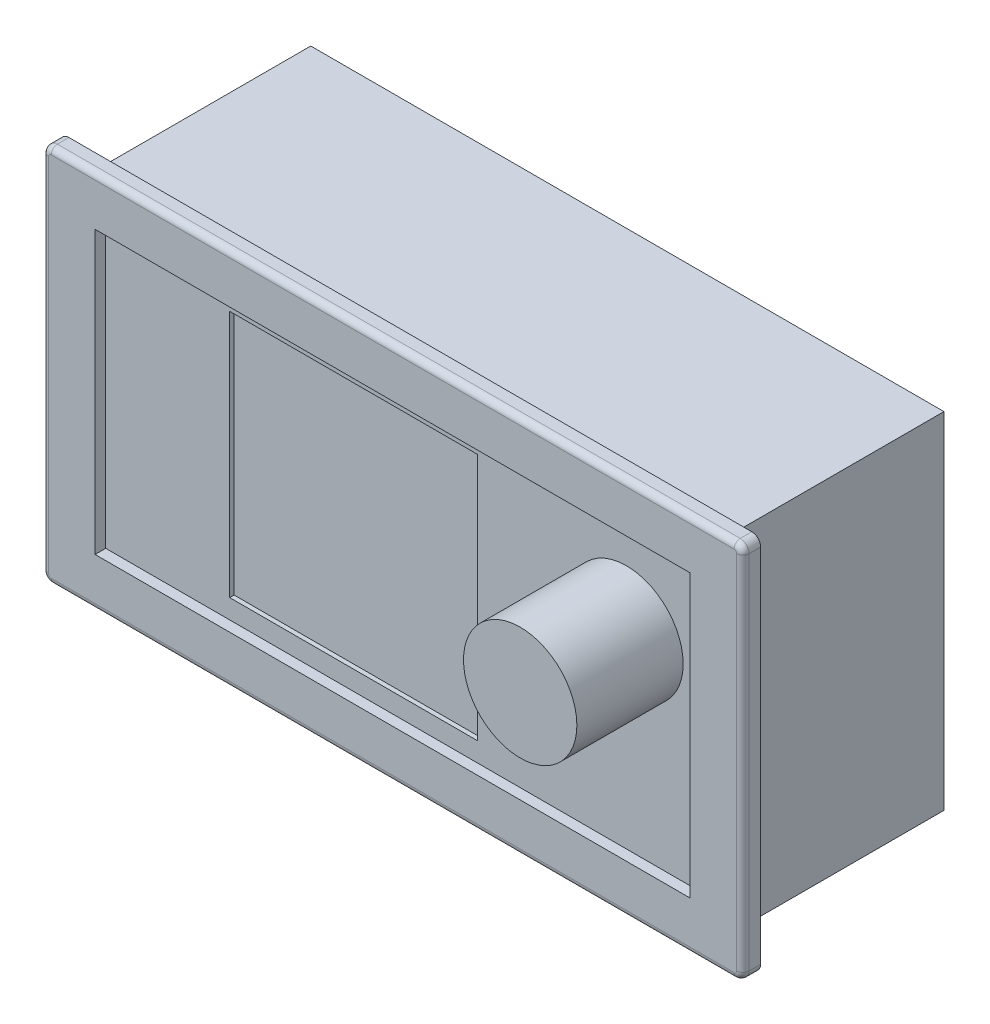
ISO-10303-21;
HEADER;
FILE_DESCRIPTION(('STEP AP214'),'2;1');
FILE_NAME('part.step','',(''),(''),'','','');
FILE_SCHEMA(('AUTOMOTIVE_DESIGN { 1 0 10303 214 1 1 1 1 }'));
ENDSEC;
DATA;
#1=APPLICATION_CONTEXT('core data for automotive mechanical design processes');
#2=APPLICATION_PROTOCOL_DEFINITION('international standard','automotive_design',2000,#1);
#3=PRODUCT_CONTEXT('',#1,'mechanical');
#4=PRODUCT('Part','Part','',(#3));
#5=PRODUCT_RELATED_PRODUCT_CATEGORY('part','',(#4));
#6=PRODUCT_DEFINITION_FORMATION('','',#4);
#7=PRODUCT_DEFINITION_CONTEXT('part definition',#1,'design');
#8=PRODUCT_DEFINITION('design','',#6,#7);
#9=PRODUCT_DEFINITION_SHAPE('','',#8);
#10=(LENGTH_UNIT() NAMED_UNIT(*) SI_UNIT(.MILLI.,.METRE.));
#11=(NAMED_UNIT(*) PLANE_ANGLE_UNIT() SI_UNIT($,.RADIAN.));
#12=(NAMED_UNIT(*) SI_UNIT($,.STERADIAN.) SOLID_ANGLE_UNIT());
#13=UNCERTAINTY_MEASURE_WITH_UNIT(LENGTH_MEASURE(1.E-05),#10,'distance_accuracy_value','');
#14=(GEOMETRIC_REPRESENTATION_CONTEXT(3) GLOBAL_UNCERTAINTY_ASSIGNED_CONTEXT((#13)) GLOBAL_UNIT_ASSIGNED_CONTEXT((#10,
#11,#12)) REPRESENTATION_CONTEXT('',''));
#15=CARTESIAN_POINT('',(0.,0.,0.));
#16=DIRECTION('',(0.,0.,1.));
#17=DIRECTION('',(1.,0.,0.));
#18=AXIS2_PLACEMENT_3D('',#15,#16,#17);
#19=CARTESIAN_POINT('',(0.,0.,26.5));
#20=DIRECTION('',(0.,0.,1.));
#21=DIRECTION('',(1.,0.,0.));
#22=AXIS2_PLACEMENT_3D('',#19,#20,#21);
#23=PLANE('',#22);
#24=DIRECTION('',(0.,1.,0.));
#25=VECTOR('',#24,1.);
#26=CARTESIAN_POINT('',(33.6,15.9,26.5));
#27=LINE('',#26,#25);
#28=CARTESIAN_POINT('',(33.6,-15.9,26.5));
#29=VERTEX_POINT('',#28);
#30=CARTESIAN_POINT('',(33.6,15.9,26.5));
#31=VERTEX_POINT('',#30);
#32=EDGE_CURVE('E64',#29,#31,#27,.T.);
#33=ORIENTED_EDGE('',*,*,#32,.F.);
#34=DIRECTION('',(1.,0.,0.));
#35=VECTOR('',#34,1.);
#36=CARTESIAN_POINT('',(-33.6,-15.9,26.5));
#37=LINE('',#36,#35);
#38=CARTESIAN_POINT('',(-33.6,-15.9,26.5));
#39=VERTEX_POINT('',#38);
#40=EDGE_CURVE('E251',#39,#29,#37,.T.);
#41=ORIENTED_EDGE('',*,*,#40,.F.);
#42=DIRECTION('',(0.,-1.,0.));
#43=VECTOR('',#42,1.);
#44=CARTESIAN_POINT('',(-33.6,15.9,26.5));
#45=LINE('',#44,#43);
#46=CARTESIAN_POINT('',(-33.6,15.9,26.5));
#47=VERTEX_POINT('',#46);
#48=EDGE_CURVE('E265',#47,#39,#45,.T.);
#49=ORIENTED_EDGE('',*,*,#48,.F.);
#50=DIRECTION('',(-1.,0.,0.));
#51=VECTOR('',#50,1.);
#52=CARTESIAN_POINT('',(-33.6,15.9,26.5));
#53=LINE('',#52,#51);
#54=EDGE_CURVE('E262',#31,#47,#53,.T.);
#55=ORIENTED_EDGE('',*,*,#54,.F.);
#56=EDGE_LOOP('',(#33,#41,#49,#55));
#57=FACE_BOUND('',#56,.T.);
#58=CARTESIAN_POINT('',(-38.55,20.4,26.5));
#59=DIRECTION('',(0.,0.,1.));
#60=DIRECTION('',(1.,0.,0.));
#61=AXIS2_PLACEMENT_3D('',#58,#59,#60);
#62=CIRCLE('',#61,0.3);
#63=CARTESIAN_POINT('',(-38.85,20.4,26.5));
#64=VERTEX_POINT('',#63);
#65=CARTESIAN_POINT('',(-38.55,20.7,26.5));
#66=VERTEX_POINT('',#65);
#67=EDGE_CURVE('E360',#64,#66,#62,.F.);
#68=ORIENTED_EDGE('',*,*,#67,.F.);
#69=DIRECTION('',(0.,-1.,0.));
#70=VECTOR('',#69,1.);
#71=CARTESIAN_POINT('',(-38.85,-21.4,26.5));
#72=LINE('',#71,#70);
#73=CARTESIAN_POINT('',(-38.85,-20.4,26.5));
#74=VERTEX_POINT('',#73);
#75=EDGE_CURVE('E329',#64,#74,#72,.T.);
#76=ORIENTED_EDGE('',*,*,#75,.T.);
#77=CARTESIAN_POINT('',(-38.55,-20.4,26.5));
#78=DIRECTION('',(0.,0.,1.));
#79=DIRECTION('',(1.,0.,0.));
#80=AXIS2_PLACEMENT_3D('',#77,#78,#79);
#81=CIRCLE('',#80,0.3);
#82=CARTESIAN_POINT('',(-38.55,-20.7,26.5));
#83=VERTEX_POINT('',#82);
#84=EDGE_CURVE('E352',#83,#74,#81,.F.);
#85=ORIENTED_EDGE('',*,*,#84,.F.);
#86=DIRECTION('',(1.,0.,0.));
#87=VECTOR('',#86,1.);
#88=CARTESIAN_POINT('',(39.55,-20.7,26.5));
#89=LINE('',#88,#87);
#90=CARTESIAN_POINT('',(38.55,-20.7,26.5));
#91=VERTEX_POINT('',#90);
#92=EDGE_CURVE('E332',#83,#91,#89,.T.);
#93=ORIENTED_EDGE('',*,*,#92,.T.);
#94=CARTESIAN_POINT('',(38.55,-20.4,26.5));
#95=DIRECTION('',(0.,0.,1.));
#96=DIRECTION('',(1.,0.,0.));
#97=AXIS2_PLACEMENT_3D('',#94,#95,#96);
#98=CIRCLE('',#97,0.3);
#99=CARTESIAN_POINT('',(38.85,-20.4,26.5));
#100=VERTEX_POINT('',#99);
#101=EDGE_CURVE('E354',#100,#91,#98,.F.);
#102=ORIENTED_EDGE('',*,*,#101,.F.);
#103=DIRECTION('',(0.,1.,0.));
#104=VECTOR('',#103,1.);
#105=CARTESIAN_POINT('',(38.85,21.4,26.5));
#106=LINE('',#105,#104);
#107=CARTESIAN_POINT('',(38.85,20.4,26.5));
#108=VERTEX_POINT('',#107);
#109=EDGE_CURVE('E323',#100,#108,#106,.T.);
#110=ORIENTED_EDGE('',*,*,#109,.T.);
#111=CARTESIAN_POINT('',(38.55,20.4,26.5));
#112=DIRECTION('',(0.,0.,1.));
#113=DIRECTION('',(1.,0.,0.));
#114=AXIS2_PLACEMENT_3D('',#111,#112,#113);
#115=CIRCLE('',#114,0.3);
#116=CARTESIAN_POINT('',(38.55,20.7,26.5));
#117=VERTEX_POINT('',#116);
#118=EDGE_CURVE('E357',#117,#108,#115,.F.);
#119=ORIENTED_EDGE('',*,*,#118,.F.);
#120=DIRECTION('',(-1.,0.,0.));
#121=VECTOR('',#120,1.);
#122=CARTESIAN_POINT('',(-39.55,20.7,26.5));
#123=LINE('',#122,#121);
#124=EDGE_CURVE('E326',#117,#66,#123,.T.);
#125=ORIENTED_EDGE('',*,*,#124,.T.);
#126=EDGE_LOOP('',(#68,#76,#85,#93,#102,#110,#119,#125));
#127=FACE_BOUND('',#126,.T.);
#128=ADVANCED_FACE('F39',(#57,#127),#23,.T.);
#129=CARTESIAN_POINT('',(35.75,19.5,24.5));
#130=DIRECTION('',(-1.,0.,0.));
#131=DIRECTION('',(0.,-1.,0.));
#132=AXIS2_PLACEMENT_3D('',#129,#130,#131);
#133=PLANE('',#132);
#134=DIRECTION('',(0.,1.,0.));
#135=VECTOR('',#134,1.);
#136=CARTESIAN_POINT('',(35.75,19.5,0.));
#137=LINE('',#136,#135);
#138=CARTESIAN_POINT('',(35.75,-19.5,0.));
#139=VERTEX_POINT('',#138);
#140=CARTESIAN_POINT('',(35.75,19.5,0.));
#141=VERTEX_POINT('',#140);
#142=EDGE_CURVE('E290',#139,#141,#137,.T.);
#143=ORIENTED_EDGE('',*,*,#142,.T.);
#144=DIRECTION('',(0.,0.,-1.));
#145=VECTOR('',#144,1.);
#146=CARTESIAN_POINT('',(35.75,19.5,24.5));
#147=LINE('',#146,#145);
#148=CARTESIAN_POINT('',(35.75,19.5,24.5));
#149=VERTEX_POINT('',#148);
#150=EDGE_CURVE('E320',#149,#141,#147,.T.);
#151=ORIENTED_EDGE('',*,*,#150,.F.);
#152=DIRECTION('',(0.,1.,0.));
#153=VECTOR('',#152,1.);
#154=CARTESIAN_POINT('',(35.75,19.5,24.5));
#155=LINE('',#154,#153);
#156=CARTESIAN_POINT('',(35.75,-19.5,24.5));
#157=VERTEX_POINT('',#156);
#158=EDGE_CURVE('E291',#157,#149,#155,.T.);
#159=ORIENTED_EDGE('',*,*,#158,.F.);
#160=DIRECTION('',(0.,0.,-1.));
#161=VECTOR('',#160,1.);
#162=CARTESIAN_POINT('',(35.75,-19.5,24.5));
#163=LINE('',#162,#161);
#164=EDGE_CURVE('E304',#157,#139,#163,.T.);
#165=ORIENTED_EDGE('',*,*,#164,.T.);
#166=EDGE_LOOP('',(#143,#151,#159,#165));
#167=FACE_BOUND('',#166,.T.);
#168=ADVANCED_FACE('F483',(#167),#133,.F.);
#169=CARTESIAN_POINT('',(-35.75,19.5,24.5));
#170=DIRECTION('',(0.,-1.,0.));
#171=DIRECTION('',(0.,0.,-1.));
#172=AXIS2_PLACEMENT_3D('',#169,#170,#171);
#173=PLANE('',#172);
#174=DIRECTION('',(-1.,0.,0.));
#175=VECTOR('',#174,1.);
#176=CARTESIAN_POINT('',(-35.75,19.5,0.));
#177=LINE('',#176,#175);
#178=CARTESIAN_POINT('',(-35.75,19.5,0.));
#179=VERTEX_POINT('',#178);
#180=EDGE_CURVE('E307',#141,#179,#177,.T.);
#181=ORIENTED_EDGE('',*,*,#180,.T.);
#182=DIRECTION('',(0.,0.,-1.));
#183=VECTOR('',#182,1.);
#184=CARTESIAN_POINT('',(-35.75,19.5,24.5));
#185=LINE('',#184,#183);
#186=CARTESIAN_POINT('',(-35.75,19.5,24.5));
#187=VERTEX_POINT('',#186);
#188=EDGE_CURVE('E317',#187,#179,#185,.T.);
#189=ORIENTED_EDGE('',*,*,#188,.F.);
#190=DIRECTION('',(-1.,0.,0.));
#191=VECTOR('',#190,1.);
#192=CARTESIAN_POINT('',(-35.75,19.5,24.5));
#193=LINE('',#192,#191);
#194=EDGE_CURVE('E294',#149,#187,#193,.T.);
#195=ORIENTED_EDGE('',*,*,#194,.F.);
#196=ORIENTED_EDGE('',*,*,#150,.T.);
#197=EDGE_LOOP('',(#181,#189,#195,#196));
#198=FACE_BOUND('',#197,.T.);
#199=ADVANCED_FACE('F489',(#198),#173,.F.);
#200=CARTESIAN_POINT('',(-35.75,19.5,24.5));
#201=DIRECTION('',(1.,0.,0.));
#202=DIRECTION('',(0.,0.,-1.));
#203=AXIS2_PLACEMENT_3D('',#200,#201,#202);
#204=PLANE('',#203);
#205=DIRECTION('',(0.,-1.,0.));
#206=VECTOR('',#205,1.);
#207=CARTESIAN_POINT('',(-35.75,19.5,0.));
#208=LINE('',#207,#206);
#209=CARTESIAN_POINT('',(-35.75,-19.5,0.));
#210=VERTEX_POINT('',#209);
#211=EDGE_CURVE('E309',#179,#210,#208,.T.);
#212=ORIENTED_EDGE('',*,*,#211,.T.);
#213=DIRECTION('',(0.,0.,-1.));
#214=VECTOR('',#213,1.);
#215=CARTESIAN_POINT('',(-35.75,-19.5,24.5));
#216=LINE('',#215,#214);
#217=CARTESIAN_POINT('',(-35.75,-19.5,24.5));
#218=VERTEX_POINT('',#217);
#219=EDGE_CURVE('E314',#218,#210,#216,.T.);
#220=ORIENTED_EDGE('',*,*,#219,.F.);
#221=DIRECTION('',(0.,-1.,0.));
#222=VECTOR('',#221,1.);
#223=CARTESIAN_POINT('',(-35.75,19.5,24.5));
#224=LINE('',#223,#222);
#225=EDGE_CURVE('E298',#187,#218,#224,.T.);
#226=ORIENTED_EDGE('',*,*,#225,.F.);
#227=ORIENTED_EDGE('',*,*,#188,.T.);
#228=EDGE_LOOP('',(#212,#220,#226,#227));
#229=FACE_BOUND('',#228,.T.);
#230=ADVANCED_FACE('F610',(#229),#204,.F.);
#231=CARTESIAN_POINT('',(-35.75,-19.5,24.5));
#232=DIRECTION('',(0.,1.,0.));
#233=DIRECTION('',(0.,0.,1.));
#234=AXIS2_PLACEMENT_3D('',#231,#232,#233);
#235=PLANE('',#234);
#236=DIRECTION('',(1.,0.,0.));
#237=VECTOR('',#236,1.);
#238=CARTESIAN_POINT('',(-35.75,-19.5,0.));
#239=LINE('',#238,#237);
#240=EDGE_CURVE('E295',#210,#139,#239,.T.);
#241=ORIENTED_EDGE('',*,*,#240,.T.);
#242=ORIENTED_EDGE('',*,*,#164,.F.);
#243=DIRECTION('',(1.,0.,0.));
#244=VECTOR('',#243,1.);
#245=CARTESIAN_POINT('',(-35.75,-19.5,24.5));
#246=LINE('',#245,#244);
#247=EDGE_CURVE('E301',#218,#157,#246,.T.);
#248=ORIENTED_EDGE('',*,*,#247,.F.);
#249=ORIENTED_EDGE('',*,*,#219,.T.);
#250=EDGE_LOOP('',(#241,#242,#248,#249));
#251=FACE_BOUND('',#250,.T.);
#252=ADVANCED_FACE('F605',(#251),#235,.F.);
#253=CARTESIAN_POINT('',(0.,0.,0.));
#254=DIRECTION('',(0.,0.,1.));
#255=DIRECTION('',(1.,0.,0.));
#256=AXIS2_PLACEMENT_3D('',#253,#254,#255);
#257=PLANE('',#256);
#258=ORIENTED_EDGE('',*,*,#142,.F.);
#259=ORIENTED_EDGE('',*,*,#240,.F.);
#260=ORIENTED_EDGE('',*,*,#211,.F.);
#261=ORIENTED_EDGE('',*,*,#180,.F.);
#262=EDGE_LOOP('',(#258,#259,#260,#261));
#263=FACE_BOUND('',#262,.T.);
#264=ADVANCED_FACE('F498',(#263),#257,.F.);
#265=CARTESIAN_POINT('',(0.,0.,24.5));
#266=DIRECTION('',(0.,0.,1.));
#267=DIRECTION('',(1.,0.,0.));
#268=AXIS2_PLACEMENT_3D('',#265,#266,#267);
#269=PLANE('',#268);
#270=DIRECTION('',(1.,0.,0.));
#271=VECTOR('',#270,1.);
#272=CARTESIAN_POINT('',(-39.55,-21.4,24.5));
#273=LINE('',#272,#271);
#274=CARTESIAN_POINT('',(-38.55,-21.4,24.5));
#275=VERTEX_POINT('',#274);
#276=CARTESIAN_POINT('',(38.55,-21.4,24.5));
#277=VERTEX_POINT('',#276);
#278=EDGE_CURVE('E287',#275,#277,#273,.T.);
#279=ORIENTED_EDGE('',*,*,#278,.F.);
#280=CARTESIAN_POINT('',(-38.55,-20.4,24.5));
#281=DIRECTION('',(0.,0.,1.));
#282=DIRECTION('',(1.,0.,0.));
#283=AXIS2_PLACEMENT_3D('',#280,#281,#282);
#284=CIRCLE('',#283,1.);
#285=CARTESIAN_POINT('',(-39.55,-20.4,24.5));
#286=VERTEX_POINT('',#285);
#287=EDGE_CURVE('E385',#275,#286,#284,.F.);
#288=ORIENTED_EDGE('',*,*,#287,.T.);
#289=DIRECTION('',(0.,-1.,0.));
#290=VECTOR('',#289,1.);
#291=CARTESIAN_POINT('',(-39.55,21.4,24.5));
#292=LINE('',#291,#290);
#293=CARTESIAN_POINT('',(-39.55,20.4,24.5));
#294=VERTEX_POINT('',#293);
#295=EDGE_CURVE('E284',#294,#286,#292,.T.);
#296=ORIENTED_EDGE('',*,*,#295,.F.);
#297=CARTESIAN_POINT('',(-38.55,20.4,24.5));
#298=DIRECTION('',(0.,0.,1.));
#299=DIRECTION('',(1.,0.,0.));
#300=AXIS2_PLACEMENT_3D('',#297,#298,#299);
#301=CIRCLE('',#300,1.);
#302=CARTESIAN_POINT('',(-38.55,21.4,24.5));
#303=VERTEX_POINT('',#302);
#304=EDGE_CURVE('E379',#294,#303,#301,.F.);
#305=ORIENTED_EDGE('',*,*,#304,.T.);
#306=DIRECTION('',(-1.,0.,0.));
#307=VECTOR('',#306,1.);
#308=CARTESIAN_POINT('',(-39.55,21.4,24.5));
#309=LINE('',#308,#307);
#310=CARTESIAN_POINT('',(38.55,21.4,24.5));
#311=VERTEX_POINT('',#310);
#312=EDGE_CURVE('E280',#311,#303,#309,.T.);
#313=ORIENTED_EDGE('',*,*,#312,.F.);
#314=CARTESIAN_POINT('',(38.55,20.4,24.5));
#315=DIRECTION('',(0.,0.,1.));
#316=DIRECTION('',(1.,0.,0.));
#317=AXIS2_PLACEMENT_3D('',#314,#315,#316);
#318=CIRCLE('',#317,1.);
#319=CARTESIAN_POINT('',(39.55,20.4,24.5));
#320=VERTEX_POINT('',#319);
#321=EDGE_CURVE('E381',#311,#320,#318,.F.);
#322=ORIENTED_EDGE('',*,*,#321,.T.);
#323=DIRECTION('',(0.,1.,0.));
#324=VECTOR('',#323,1.);
#325=CARTESIAN_POINT('',(39.55,21.4,24.5));
#326=LINE('',#325,#324);
#327=CARTESIAN_POINT('',(39.55,-20.4,24.5));
#328=VERTEX_POINT('',#327);
#329=EDGE_CURVE('E277',#328,#320,#326,.T.);
#330=ORIENTED_EDGE('',*,*,#329,.F.);
#331=CARTESIAN_POINT('',(38.55,-20.4,24.5));
#332=DIRECTION('',(0.,0.,1.));
#333=DIRECTION('',(1.,0.,0.));
#334=AXIS2_PLACEMENT_3D('',#331,#332,#333);
#335=CIRCLE('',#334,1.);
#336=EDGE_CURVE('E383',#328,#277,#335,.F.);
#337=ORIENTED_EDGE('',*,*,#336,.T.);
#338=EDGE_LOOP('',(#279,#288,#296,#305,#313,#322,#330,#337));
#339=FACE_BOUND('',#338,.T.);
#340=ORIENTED_EDGE('',*,*,#247,.T.);
#341=ORIENTED_EDGE('',*,*,#158,.T.);
#342=ORIENTED_EDGE('',*,*,#194,.T.);
#343=ORIENTED_EDGE('',*,*,#225,.T.);
#344=EDGE_LOOP('',(#340,#341,#342,#343));
#345=FACE_BOUND('',#344,.T.);
#346=ADVANCED_FACE('F421',(#339,#345),#269,.F.);
#347=CARTESIAN_POINT('',(39.55,21.4,26.5));
#348=DIRECTION('',(-1.,0.,0.));
#349=DIRECTION('',(0.,-1.,0.));
#350=AXIS2_PLACEMENT_3D('',#347,#348,#349);
#351=PLANE('',#350);
#352=DIRECTION('',(0.,1.,0.));
#353=VECTOR('',#352,1.);
#354=CARTESIAN_POINT('',(39.55,-21.4,25.8));
#355=LINE('',#354,#353);
#356=CARTESIAN_POINT('',(39.55,20.4,25.8));
#357=VERTEX_POINT('',#356);
#358=CARTESIAN_POINT('',(39.55,-20.4,25.8));
#359=VERTEX_POINT('',#358);
#360=EDGE_CURVE('E344',#357,#359,#355,.F.);
#361=ORIENTED_EDGE('',*,*,#360,.T.);
#362=DIRECTION('',(0.,0.,-1.));
#363=VECTOR('',#362,1.);
#364=CARTESIAN_POINT('',(39.55,-20.4,26.5));
#365=LINE('',#364,#363);
#366=EDGE_CURVE('E393',#359,#328,#365,.T.);
#367=ORIENTED_EDGE('',*,*,#366,.T.);
#368=ORIENTED_EDGE('',*,*,#329,.T.);
#369=DIRECTION('',(0.,0.,-1.));
#370=VECTOR('',#369,1.);
#371=CARTESIAN_POINT('',(39.55,20.4,26.5));
#372=LINE('',#371,#370);
#373=EDGE_CURVE('E391',#320,#357,#372,.F.);
#374=ORIENTED_EDGE('',*,*,#373,.T.);
#375=EDGE_LOOP('',(#361,#367,#368,#374));
#376=FACE_BOUND('',#375,.T.);
#377=ADVANCED_FACE('F441',(#376),#351,.F.);
#378=CARTESIAN_POINT('',(-39.55,21.4,26.5));
#379=DIRECTION('',(0.,-1.,0.));
#380=DIRECTION('',(0.,0.,-1.));
#381=AXIS2_PLACEMENT_3D('',#378,#379,#380);
#382=PLANE('',#381);
#383=DIRECTION('',(-1.,0.,0.));
#384=VECTOR('',#383,1.);
#385=CARTESIAN_POINT('',(39.55,21.4,25.8));
#386=LINE('',#385,#384);
#387=CARTESIAN_POINT('',(-38.55,21.4,25.8));
#388=VERTEX_POINT('',#387);
#389=CARTESIAN_POINT('',(38.55,21.4,25.8));
#390=VERTEX_POINT('',#389);
#391=EDGE_CURVE('E341',#388,#390,#386,.F.);
#392=ORIENTED_EDGE('',*,*,#391,.T.);
#393=DIRECTION('',(0.,0.,-1.));
#394=VECTOR('',#393,1.);
#395=CARTESIAN_POINT('',(38.55,21.4,26.5));
#396=LINE('',#395,#394);
#397=EDGE_CURVE('E11',#390,#311,#396,.T.);
#398=ORIENTED_EDGE('',*,*,#397,.T.);
#399=ORIENTED_EDGE('',*,*,#312,.T.);
#400=DIRECTION('',(0.,0.,-1.));
#401=VECTOR('',#400,1.);
#402=CARTESIAN_POINT('',(-38.55,21.4,26.5));
#403=LINE('',#402,#401);
#404=EDGE_CURVE('E48',#303,#388,#403,.F.);
#405=ORIENTED_EDGE('',*,*,#404,.T.);
#406=EDGE_LOOP('',(#392,#398,#399,#405));
#407=FACE_BOUND('',#406,.T.);
#408=ADVANCED_FACE('F473',(#407),#382,.F.);
#409=CARTESIAN_POINT('',(-39.55,21.4,26.5));
#410=DIRECTION('',(1.,0.,0.));
#411=DIRECTION('',(0.,0.,-1.));
#412=AXIS2_PLACEMENT_3D('',#409,#410,#411);
#413=PLANE('',#412);
#414=ORIENTED_EDGE('',*,*,#295,.T.);
#415=DIRECTION('',(0.,0.,-1.));
#416=VECTOR('',#415,1.);
#417=CARTESIAN_POINT('',(-39.55,-20.4,26.5));
#418=LINE('',#417,#416);
#419=CARTESIAN_POINT('',(-39.55,-20.4,25.8));
#420=VERTEX_POINT('',#419);
#421=EDGE_CURVE('E389',#286,#420,#418,.F.);
#422=ORIENTED_EDGE('',*,*,#421,.T.);
#423=DIRECTION('',(0.,-1.,0.));
#424=VECTOR('',#423,1.);
#425=CARTESIAN_POINT('',(-39.55,21.4,25.8));
#426=LINE('',#425,#424);
#427=CARTESIAN_POINT('',(-39.55,20.4,25.8));
#428=VERTEX_POINT('',#427);
#429=EDGE_CURVE('E338',#420,#428,#426,.F.);
#430=ORIENTED_EDGE('',*,*,#429,.T.);
#431=DIRECTION('',(0.,0.,-1.));
#432=VECTOR('',#431,1.);
#433=CARTESIAN_POINT('',(-39.55,20.4,26.5));
#434=LINE('',#433,#432);
#435=EDGE_CURVE('E387',#428,#294,#434,.T.);
#436=ORIENTED_EDGE('',*,*,#435,.T.);
#437=EDGE_LOOP('',(#414,#422,#430,#436));
#438=FACE_BOUND('',#437,.T.);
#439=ADVANCED_FACE('F466',(#438),#413,.F.);
#440=CARTESIAN_POINT('',(-39.55,-21.4,26.5));
#441=DIRECTION('',(0.,1.,0.));
#442=DIRECTION('',(0.,0.,1.));
#443=AXIS2_PLACEMENT_3D('',#440,#441,#442);
#444=PLANE('',#443);
#445=DIRECTION('',(1.,0.,0.));
#446=VECTOR('',#445,1.);
#447=CARTESIAN_POINT('',(-39.55,-21.4,25.8));
#448=LINE('',#447,#446);
#449=CARTESIAN_POINT('',(38.55,-21.4,25.8));
#450=VERTEX_POINT('',#449);
#451=CARTESIAN_POINT('',(-38.55,-21.4,25.8));
#452=VERTEX_POINT('',#451);
#453=EDGE_CURVE('E335',#450,#452,#448,.F.);
#454=ORIENTED_EDGE('',*,*,#453,.T.);
#455=DIRECTION('',(0.,0.,-1.));
#456=VECTOR('',#455,1.);
#457=CARTESIAN_POINT('',(-38.55,-21.4,26.5));
#458=LINE('',#457,#456);
#459=EDGE_CURVE('E377',#452,#275,#458,.T.);
#460=ORIENTED_EDGE('',*,*,#459,.T.);
#461=ORIENTED_EDGE('',*,*,#278,.T.);
#462=DIRECTION('',(0.,0.,-1.));
#463=VECTOR('',#462,1.);
#464=CARTESIAN_POINT('',(38.55,-21.4,26.5));
#465=LINE('',#464,#463);
#466=EDGE_CURVE('E375',#277,#450,#465,.F.);
#467=ORIENTED_EDGE('',*,*,#466,.T.);
#468=EDGE_LOOP('',(#454,#460,#461,#467));
#469=FACE_BOUND('',#468,.T.);
#470=ADVANCED_FACE('F417',(#469),#444,.F.);
#471=CARTESIAN_POINT('',(0.,20.7,25.8));
#472=DIRECTION('',(1.,0.,0.));
#473=DIRECTION('',(0.,0.,-1.));
#474=AXIS2_PLACEMENT_3D('',#471,#472,#473);
#475=CYLINDRICAL_SURFACE('',#474,0.7);
#476=ORIENTED_EDGE('',*,*,#391,.F.);
#477=CARTESIAN_POINT('',(-38.55,20.7,25.8));
#478=DIRECTION('',(1.,0.,0.));
#479=DIRECTION('',(0.,0.,-1.));
#480=AXIS2_PLACEMENT_3D('',#477,#478,#479);
#481=CIRCLE('',#480,0.7);
#482=EDGE_CURVE('E349',#388,#66,#481,.T.);
#483=ORIENTED_EDGE('',*,*,#482,.T.);
#484=ORIENTED_EDGE('',*,*,#124,.F.);
#485=CARTESIAN_POINT('',(38.55,20.7,25.8));
#486=DIRECTION('',(-1.,0.,0.));
#487=DIRECTION('',(0.,0.,1.));
#488=AXIS2_PLACEMENT_3D('',#485,#486,#487);
#489=CIRCLE('',#488,0.7);
#490=EDGE_CURVE('E347',#117,#390,#489,.T.);
#491=ORIENTED_EDGE('',*,*,#490,.T.);
#492=EDGE_LOOP('',(#476,#483,#484,#491));
#493=FACE_BOUND('',#492,.T.);
#494=ADVANCED_FACE('F454',(#493),#475,.T.);
#495=CARTESIAN_POINT('',(-38.85,0.,25.8));
#496=DIRECTION('',(0.,1.,0.));
#497=DIRECTION('',(0.,0.,1.));
#498=AXIS2_PLACEMENT_3D('',#495,#496,#497);
#499=CYLINDRICAL_SURFACE('',#498,0.7);
#500=ORIENTED_EDGE('',*,*,#429,.F.);
#501=CARTESIAN_POINT('',(-38.85,-20.4,25.8));
#502=DIRECTION('',(0.,1.,0.));
#503=DIRECTION('',(0.,0.,1.));
#504=AXIS2_PLACEMENT_3D('',#501,#502,#503);
#505=CIRCLE('',#504,0.7);
#506=EDGE_CURVE('E372',#420,#74,#505,.T.);
#507=ORIENTED_EDGE('',*,*,#506,.T.);
#508=ORIENTED_EDGE('',*,*,#75,.F.);
#509=CARTESIAN_POINT('',(-38.85,20.4,25.8));
#510=DIRECTION('',(0.,-1.,0.));
#511=DIRECTION('',(0.,0.,-1.));
#512=AXIS2_PLACEMENT_3D('',#509,#510,#511);
#513=CIRCLE('',#512,0.7);
#514=EDGE_CURVE('E370',#64,#428,#513,.T.);
#515=ORIENTED_EDGE('',*,*,#514,.T.);
#516=EDGE_LOOP('',(#500,#507,#508,#515));
#517=FACE_BOUND('',#516,.T.);
#518=ADVANCED_FACE('F463',(#517),#499,.T.);
#519=CARTESIAN_POINT('',(38.85,0.,25.8));
#520=DIRECTION('',(0.,-1.,0.));
#521=DIRECTION('',(1.,0.,0.));
#522=AXIS2_PLACEMENT_3D('',#519,#520,#521);
#523=CYLINDRICAL_SURFACE('',#522,0.7);
#524=ORIENTED_EDGE('',*,*,#360,.F.);
#525=CARTESIAN_POINT('',(38.85,20.4,25.8));
#526=DIRECTION('',(0.,-1.,0.));
#527=DIRECTION('',(0.,0.,-1.));
#528=AXIS2_PLACEMENT_3D('',#525,#526,#527);
#529=CIRCLE('',#528,0.7);
#530=EDGE_CURVE('E364',#357,#108,#529,.T.);
#531=ORIENTED_EDGE('',*,*,#530,.T.);
#532=ORIENTED_EDGE('',*,*,#109,.F.);
#533=CARTESIAN_POINT('',(38.85,-20.4,25.8));
#534=DIRECTION('',(0.,1.,0.));
#535=DIRECTION('',(0.,0.,1.));
#536=AXIS2_PLACEMENT_3D('',#533,#534,#535);
#537=CIRCLE('',#536,0.7);
#538=EDGE_CURVE('E362',#100,#359,#537,.T.);
#539=ORIENTED_EDGE('',*,*,#538,.T.);
#540=EDGE_LOOP('',(#524,#531,#532,#539));
#541=FACE_BOUND('',#540,.T.);
#542=ADVANCED_FACE('F438',(#541),#523,.T.);
#543=CARTESIAN_POINT('',(0.,-20.7,25.8));
#544=DIRECTION('',(-1.,0.,0.));
#545=DIRECTION('',(0.,0.,1.));
#546=AXIS2_PLACEMENT_3D('',#543,#544,#545);
#547=CYLINDRICAL_SURFACE('',#546,0.7);
#548=ORIENTED_EDGE('',*,*,#453,.F.);
#549=CARTESIAN_POINT('',(38.55,-20.7,25.8));
#550=DIRECTION('',(-1.,0.,0.));
#551=DIRECTION('',(0.,0.,1.));
#552=AXIS2_PLACEMENT_3D('',#549,#550,#551);
#553=CIRCLE('',#552,0.7);
#554=EDGE_CURVE('E368',#450,#91,#553,.T.);
#555=ORIENTED_EDGE('',*,*,#554,.T.);
#556=ORIENTED_EDGE('',*,*,#92,.F.);
#557=CARTESIAN_POINT('',(-38.55,-20.7,25.8));
#558=DIRECTION('',(1.,0.,0.));
#559=DIRECTION('',(0.,0.,-1.));
#560=AXIS2_PLACEMENT_3D('',#557,#558,#559);
#561=CIRCLE('',#560,0.7);
#562=EDGE_CURVE('E366',#83,#452,#561,.T.);
#563=ORIENTED_EDGE('',*,*,#562,.T.);
#564=EDGE_LOOP('',(#548,#555,#556,#563));
#565=FACE_BOUND('',#564,.T.);
#566=ADVANCED_FACE('F430',(#565),#547,.T.);
#567=CARTESIAN_POINT('',(-38.55,20.4,26.5));
#568=DIRECTION('',(0.,0.,-1.));
#569=DIRECTION('',(-1.,0.,0.));
#570=AXIS2_PLACEMENT_3D('',#567,#568,#569);
#571=CYLINDRICAL_SURFACE('',#570,1.);
#572=ORIENTED_EDGE('',*,*,#304,.F.);
#573=ORIENTED_EDGE('',*,*,#435,.F.);
#574=CARTESIAN_POINT('',(-38.55,20.4,25.8));
#575=DIRECTION('',(0.,0.,1.));
#576=DIRECTION('',(1.,0.,0.));
#577=AXIS2_PLACEMENT_3D('',#574,#575,#576);
#578=CIRCLE('',#577,1.);
#579=EDGE_CURVE('E281',#388,#428,#578,.T.);
#580=ORIENTED_EDGE('',*,*,#579,.F.);
#581=ORIENTED_EDGE('',*,*,#404,.F.);
#582=EDGE_LOOP('',(#572,#573,#580,#581));
#583=FACE_BOUND('',#582,.T.);
#584=ADVANCED_FACE('F469',(#583),#571,.T.);
#585=CARTESIAN_POINT('',(-38.55,20.4,25.8));
#586=DIRECTION('',(0.,0.,1.));
#587=DIRECTION('',(1.,0.,0.));
#588=AXIS2_PLACEMENT_3D('',#585,#586,#587);
#589=DEGENERATE_TOROIDAL_SURFACE('',#588,0.3,0.7,.T.);
#590=ORIENTED_EDGE('',*,*,#482,.F.);
#591=ORIENTED_EDGE('',*,*,#579,.T.);
#592=ORIENTED_EDGE('',*,*,#514,.F.);
#593=ORIENTED_EDGE('',*,*,#67,.T.);
#594=EDGE_LOOP('',(#590,#591,#592,#593));
#595=FACE_BOUND('',#594,.T.);
#596=ADVANCED_FACE('F458',(#595),#589,.T.);
#597=CARTESIAN_POINT('',(38.55,20.4,26.5));
#598=DIRECTION('',(0.,0.,-1.));
#599=DIRECTION('',(-1.,0.,0.));
#600=AXIS2_PLACEMENT_3D('',#597,#598,#599);
#601=CYLINDRICAL_SURFACE('',#600,1.);
#602=ORIENTED_EDGE('',*,*,#321,.F.);
#603=ORIENTED_EDGE('',*,*,#397,.F.);
#604=CARTESIAN_POINT('',(38.55,20.4,25.8));
#605=DIRECTION('',(0.,0.,1.));
#606=DIRECTION('',(1.,0.,0.));
#607=AXIS2_PLACEMENT_3D('',#604,#605,#606);
#608=CIRCLE('',#607,1.);
#609=EDGE_CURVE('E398',#357,#390,#608,.T.);
#610=ORIENTED_EDGE('',*,*,#609,.F.);
#611=ORIENTED_EDGE('',*,*,#373,.F.);
#612=EDGE_LOOP('',(#602,#603,#610,#611));
#613=FACE_BOUND('',#612,.T.);
#614=ADVANCED_FACE('F445',(#613),#601,.T.);
#615=CARTESIAN_POINT('',(38.55,20.4,25.8));
#616=DIRECTION('',(0.,0.,1.));
#617=DIRECTION('',(1.,0.,0.));
#618=AXIS2_PLACEMENT_3D('',#615,#616,#617);
#619=DEGENERATE_TOROIDAL_SURFACE('',#618,0.3,0.7,.T.);
#620=ORIENTED_EDGE('',*,*,#490,.F.);
#621=ORIENTED_EDGE('',*,*,#118,.T.);
#622=ORIENTED_EDGE('',*,*,#530,.F.);
#623=ORIENTED_EDGE('',*,*,#609,.T.);
#624=EDGE_LOOP('',(#620,#621,#622,#623));
#625=FACE_BOUND('',#624,.T.);
#626=ADVANCED_FACE('F449',(#625),#619,.T.);
#627=CARTESIAN_POINT('',(38.55,-20.4,26.5));
#628=DIRECTION('',(0.,0.,-1.));
#629=DIRECTION('',(-1.,0.,0.));
#630=AXIS2_PLACEMENT_3D('',#627,#628,#629);
#631=CYLINDRICAL_SURFACE('',#630,1.);
#632=ORIENTED_EDGE('',*,*,#336,.F.);
#633=ORIENTED_EDGE('',*,*,#366,.F.);
#634=CARTESIAN_POINT('',(38.55,-20.4,25.8));
#635=DIRECTION('',(0.,0.,1.));
#636=DIRECTION('',(1.,0.,0.));
#637=AXIS2_PLACEMENT_3D('',#634,#635,#636);
#638=CIRCLE('',#637,1.);
#639=EDGE_CURVE('E400',#450,#359,#638,.T.);
#640=ORIENTED_EDGE('',*,*,#639,.F.);
#641=ORIENTED_EDGE('',*,*,#466,.F.);
#642=EDGE_LOOP('',(#632,#633,#640,#641));
#643=FACE_BOUND('',#642,.T.);
#644=ADVANCED_FACE('F428',(#643),#631,.T.);
#645=CARTESIAN_POINT('',(38.55,-20.4,25.8));
#646=DIRECTION('',(0.,0.,1.));
#647=DIRECTION('',(1.,0.,0.));
#648=AXIS2_PLACEMENT_3D('',#645,#646,#647);
#649=DEGENERATE_TOROIDAL_SURFACE('',#648,0.3,0.7,.T.);
#650=ORIENTED_EDGE('',*,*,#538,.F.);
#651=ORIENTED_EDGE('',*,*,#101,.T.);
#652=ORIENTED_EDGE('',*,*,#554,.F.);
#653=ORIENTED_EDGE('',*,*,#639,.T.);
#654=EDGE_LOOP('',(#650,#651,#652,#653));
#655=FACE_BOUND('',#654,.T.);
#656=ADVANCED_FACE('F435',(#655),#649,.T.);
#657=CARTESIAN_POINT('',(-38.55,-20.4,26.5));
#658=DIRECTION('',(0.,0.,-1.));
#659=DIRECTION('',(-1.,0.,0.));
#660=AXIS2_PLACEMENT_3D('',#657,#658,#659);
#661=CYLINDRICAL_SURFACE('',#660,1.);
#662=ORIENTED_EDGE('',*,*,#287,.F.);
#663=ORIENTED_EDGE('',*,*,#459,.F.);
#664=CARTESIAN_POINT('',(-38.55,-20.4,25.8));
#665=DIRECTION('',(0.,0.,1.));
#666=DIRECTION('',(1.,0.,0.));
#667=AXIS2_PLACEMENT_3D('',#664,#665,#666);
#668=CIRCLE('',#667,1.);
#669=EDGE_CURVE('E43',#420,#452,#668,.T.);
#670=ORIENTED_EDGE('',*,*,#669,.F.);
#671=ORIENTED_EDGE('',*,*,#421,.F.);
#672=EDGE_LOOP('',(#662,#663,#670,#671));
#673=FACE_BOUND('',#672,.T.);
#674=ADVANCED_FACE('F41',(#673),#661,.T.);
#675=CARTESIAN_POINT('',(-38.55,-20.4,25.8));
#676=DIRECTION('',(0.,0.,1.));
#677=DIRECTION('',(1.,0.,0.));
#678=AXIS2_PLACEMENT_3D('',#675,#676,#677);
#679=DEGENERATE_TOROIDAL_SURFACE('',#678,0.3,0.7,.T.);
#680=ORIENTED_EDGE('',*,*,#506,.F.);
#681=ORIENTED_EDGE('',*,*,#669,.T.);
#682=ORIENTED_EDGE('',*,*,#562,.F.);
#683=ORIENTED_EDGE('',*,*,#84,.T.);
#684=EDGE_LOOP('',(#680,#681,#682,#683));
#685=FACE_BOUND('',#684,.T.);
#686=ADVANCED_FACE('F410',(#685),#679,.T.);
#687=CARTESIAN_POINT('',(33.6,15.9,25.3));
#688=DIRECTION('',(1.,0.,0.));
#689=DIRECTION('',(0.,0.,-1.));
#690=AXIS2_PLACEMENT_3D('',#687,#688,#689);
#691=PLANE('',#690);
#692=ORIENTED_EDGE('',*,*,#32,.T.);
#693=DIRECTION('',(0.,0.,1.));
#694=VECTOR('',#693,1.);
#695=CARTESIAN_POINT('',(33.6,15.9,25.3));
#696=LINE('',#695,#694);
#697=CARTESIAN_POINT('',(33.6,15.9,25.3));
#698=VERTEX_POINT('',#697);
#699=EDGE_CURVE('E260',#698,#31,#696,.T.);
#700=ORIENTED_EDGE('',*,*,#699,.F.);
#701=DIRECTION('',(0.,1.,0.));
#702=VECTOR('',#701,1.);
#703=CARTESIAN_POINT('',(33.6,15.9,25.3));
#704=LINE('',#703,#702);
#705=CARTESIAN_POINT('',(33.6,-15.9,25.3));
#706=VERTEX_POINT('',#705);
#707=EDGE_CURVE('E247',#706,#698,#704,.T.);
#708=ORIENTED_EDGE('',*,*,#707,.F.);
#709=DIRECTION('',(0.,0.,1.));
#710=VECTOR('',#709,1.);
#711=CARTESIAN_POINT('',(33.6,-15.9,25.3));
#712=LINE('',#711,#710);
#713=EDGE_CURVE('E270',#706,#29,#712,.T.);
#714=ORIENTED_EDGE('',*,*,#713,.T.);
#715=EDGE_LOOP('',(#692,#700,#708,#714));
#716=FACE_BOUND('',#715,.T.);
#717=ADVANCED_FACE('F494',(#716),#691,.F.);
#718=CARTESIAN_POINT('',(-33.6,-15.9,25.3));
#719=DIRECTION('',(0.,-1.,0.));
#720=DIRECTION('',(0.,0.,-1.));
#721=AXIS2_PLACEMENT_3D('',#718,#719,#720);
#722=PLANE('',#721);
#723=ORIENTED_EDGE('',*,*,#40,.T.);
#724=ORIENTED_EDGE('',*,*,#713,.F.);
#725=DIRECTION('',(1.,0.,0.));
#726=VECTOR('',#725,1.);
#727=CARTESIAN_POINT('',(-33.6,-15.9,25.3));
#728=LINE('',#727,#726);
#729=CARTESIAN_POINT('',(-33.6,-15.9,25.3));
#730=VERTEX_POINT('',#729);
#731=EDGE_CURVE('E257',#730,#706,#728,.T.);
#732=ORIENTED_EDGE('',*,*,#731,.F.);
#733=DIRECTION('',(0.,0.,1.));
#734=VECTOR('',#733,1.);
#735=CARTESIAN_POINT('',(-33.6,-15.9,25.3));
#736=LINE('',#735,#734);
#737=EDGE_CURVE('E272',#730,#39,#736,.T.);
#738=ORIENTED_EDGE('',*,*,#737,.T.);
#739=EDGE_LOOP('',(#723,#724,#732,#738));
#740=FACE_BOUND('',#739,.T.);
#741=ADVANCED_FACE('F526',(#740),#722,.F.);
#742=CARTESIAN_POINT('',(-33.6,15.9,25.3));
#743=DIRECTION('',(-1.,0.,0.));
#744=DIRECTION('',(0.,0.,1.));
#745=AXIS2_PLACEMENT_3D('',#742,#743,#744);
#746=PLANE('',#745);
#747=ORIENTED_EDGE('',*,*,#48,.T.);
#748=ORIENTED_EDGE('',*,*,#737,.F.);
#749=DIRECTION('',(0.,-1.,0.));
#750=VECTOR('',#749,1.);
#751=CARTESIAN_POINT('',(-33.6,15.9,25.3));
#752=LINE('',#751,#750);
#753=CARTESIAN_POINT('',(-33.6,15.9,25.3));
#754=VERTEX_POINT('',#753);
#755=EDGE_CURVE('E254',#754,#730,#752,.T.);
#756=ORIENTED_EDGE('',*,*,#755,.F.);
#757=DIRECTION('',(0.,0.,1.));
#758=VECTOR('',#757,1.);
#759=CARTESIAN_POINT('',(-33.6,15.9,25.3));
#760=LINE('',#759,#758);
#761=EDGE_CURVE('E274',#754,#47,#760,.T.);
#762=ORIENTED_EDGE('',*,*,#761,.T.);
#763=EDGE_LOOP('',(#747,#748,#756,#762));
#764=FACE_BOUND('',#763,.T.);
#765=ADVANCED_FACE('F698',(#764),#746,.F.);
#766=CARTESIAN_POINT('',(-33.6,15.9,25.3));
#767=DIRECTION('',(0.,1.,0.));
#768=DIRECTION('',(0.,0.,1.));
#769=AXIS2_PLACEMENT_3D('',#766,#767,#768);
#770=PLANE('',#769);
#771=ORIENTED_EDGE('',*,*,#54,.T.);
#772=ORIENTED_EDGE('',*,*,#761,.F.);
#773=DIRECTION('',(-1.,0.,0.));
#774=VECTOR('',#773,1.);
#775=CARTESIAN_POINT('',(-33.6,15.9,25.3));
#776=LINE('',#775,#774);
#777=EDGE_CURVE('E250',#698,#754,#776,.T.);
#778=ORIENTED_EDGE('',*,*,#777,.F.);
#779=ORIENTED_EDGE('',*,*,#699,.T.);
#780=EDGE_LOOP('',(#771,#772,#778,#779));
#781=FACE_BOUND('',#780,.T.);
#782=ADVANCED_FACE('F707',(#781),#770,.F.);
#783=CARTESIAN_POINT('',(0.,0.,25.3));
#784=DIRECTION('',(0.,0.,1.));
#785=DIRECTION('',(1.,0.,0.));
#786=AXIS2_PLACEMENT_3D('',#783,#784,#785);
#787=PLANE('',#786);
#788=DIRECTION('',(0.,1.,0.));
#789=VECTOR('',#788,1.);
#790=CARTESIAN_POINT('',(8.4,14.2825177594119,25.3));
#791=LINE('',#790,#789);
#792=CARTESIAN_POINT('',(8.4,-13.7174822405881,25.3));
#793=VERTEX_POINT('',#792);
#794=CARTESIAN_POINT('',(8.4,14.2825177594119,25.3));
#795=VERTEX_POINT('',#794);
#796=EDGE_CURVE('E208',#793,#795,#791,.T.);
#797=ORIENTED_EDGE('',*,*,#796,.F.);
#798=DIRECTION('',(1.,0.,0.));
#799=VECTOR('',#798,1.);
#800=CARTESIAN_POINT('',(-19.6,-13.7174822405881,25.3));
#801=LINE('',#800,#799);
#802=CARTESIAN_POINT('',(-19.6,-13.7174822405881,25.3));
#803=VERTEX_POINT('',#802);
#804=EDGE_CURVE('E225',#803,#793,#801,.T.);
#805=ORIENTED_EDGE('',*,*,#804,.F.);
#806=DIRECTION('',(0.,-1.,0.));
#807=VECTOR('',#806,1.);
#808=CARTESIAN_POINT('',(-19.6,14.2825177594119,25.3));
#809=LINE('',#808,#807);
#810=CARTESIAN_POINT('',(-19.6,14.2825177594119,25.3));
#811=VERTEX_POINT('',#810);
#812=EDGE_CURVE('E56',#811,#803,#809,.T.);
#813=ORIENTED_EDGE('',*,*,#812,.F.);
#814=DIRECTION('',(-1.,0.,0.));
#815=VECTOR('',#814,1.);
#816=CARTESIAN_POINT('',(-19.6,14.2825177594119,25.3));
#817=LINE('',#816,#815);
#818=EDGE_CURVE('E233',#795,#811,#817,.T.);
#819=ORIENTED_EDGE('',*,*,#818,.F.);
#820=EDGE_LOOP('',(#797,#805,#813,#819));
#821=FACE_BOUND('',#820,.T.);
#822=CARTESIAN_POINT('',(25.2,5.4,25.3));
#823=DIRECTION('',(0.,0.,1.));
#824=DIRECTION('',(1.,0.,0.));
#825=AXIS2_PLACEMENT_3D('',#822,#823,#824);
#826=CIRCLE('',#825,6.4);
#827=CARTESIAN_POINT('',(31.6,5.4,25.3));
#828=VERTEX_POINT('',#827);
#829=EDGE_CURVE('E238',#828,#828,#826,.T.);
#830=ORIENTED_EDGE('',*,*,#829,.F.);
#831=EDGE_LOOP('',(#830));
#832=FACE_BOUND('',#831,.T.);
#833=ORIENTED_EDGE('',*,*,#707,.T.);
#834=ORIENTED_EDGE('',*,*,#777,.T.);
#835=ORIENTED_EDGE('',*,*,#755,.T.);
#836=ORIENTED_EDGE('',*,*,#731,.T.);
#837=EDGE_LOOP('',(#833,#834,#835,#836));
#838=FACE_BOUND('',#837,.T.);
#839=ADVANCED_FACE('F716',(#821,#832,#838),#787,.T.);
#840=CARTESIAN_POINT('',(25.2,5.4,37.3));
#841=DIRECTION('',(0.,0.,-1.));
#842=DIRECTION('',(-1.,0.,0.));
#843=AXIS2_PLACEMENT_3D('',#840,#841,#842);
#844=CYLINDRICAL_SURFACE('',#843,6.4);
#845=CARTESIAN_POINT('',(25.2,5.4,37.3));
#846=DIRECTION('',(0.,0.,1.));
#847=DIRECTION('',(1.,0.,0.));
#848=AXIS2_PLACEMENT_3D('',#845,#846,#847);
#849=CIRCLE('',#848,6.4);
#850=CARTESIAN_POINT('',(31.6,5.4,37.3));
#851=VERTEX_POINT('',#850);
#852=EDGE_CURVE('E242',#851,#851,#849,.T.);
#853=ORIENTED_EDGE('',*,*,#852,.F.);
#854=EDGE_LOOP('',(#853));
#855=FACE_BOUND('',#854,.T.);
#856=ORIENTED_EDGE('',*,*,#829,.T.);
#857=EDGE_LOOP('',(#856));
#858=FACE_BOUND('',#857,.T.);
#859=ADVANCED_FACE('F725',(#855,#858),#844,.T.);
#860=CARTESIAN_POINT('',(25.2,5.4,37.3));
#861=DIRECTION('',(0.,0.,1.));
#862=DIRECTION('',(1.,0.,0.));
#863=AXIS2_PLACEMENT_3D('',#860,#861,#862);
#864=PLANE('',#863);
#865=ORIENTED_EDGE('',*,*,#852,.T.);
#866=EDGE_LOOP('',(#865));
#867=FACE_BOUND('',#866,.T.);
#868=ADVANCED_FACE('F733',(#867),#864,.T.);
#869=CARTESIAN_POINT('',(8.4,14.2825177594119,24.8));
#870=DIRECTION('',(1.,0.,0.));
#871=DIRECTION('',(0.,1.,0.));
#872=AXIS2_PLACEMENT_3D('',#869,#870,#871);
#873=PLANE('',#872);
#874=ORIENTED_EDGE('',*,*,#796,.T.);
#875=DIRECTION('',(0.,0.,1.));
#876=VECTOR('',#875,1.);
#877=CARTESIAN_POINT('',(8.4,14.2825177594119,24.8));
#878=LINE('',#877,#876);
#879=CARTESIAN_POINT('',(8.4,14.2825177594119,24.8));
#880=VERTEX_POINT('',#879);
#881=EDGE_CURVE('E201',#880,#795,#878,.T.);
#882=ORIENTED_EDGE('',*,*,#881,.F.);
#883=DIRECTION('',(0.,1.,0.));
#884=VECTOR('',#883,1.);
#885=CARTESIAN_POINT('',(8.4,14.2825177594119,24.8));
#886=LINE('',#885,#884);
#887=CARTESIAN_POINT('',(8.4,-13.7174822405881,24.8));
#888=VERTEX_POINT('',#887);
#889=EDGE_CURVE('E205',#888,#880,#886,.T.);
#890=ORIENTED_EDGE('',*,*,#889,.F.);
#891=DIRECTION('',(0.,0.,1.));
#892=VECTOR('',#891,1.);
#893=CARTESIAN_POINT('',(8.4,-13.7174822405881,24.8));
#894=LINE('',#893,#892);
#895=EDGE_CURVE('E236',#888,#793,#894,.T.);
#896=ORIENTED_EDGE('',*,*,#895,.T.);
#897=EDGE_LOOP('',(#874,#882,#890,#896));
#898=FACE_BOUND('',#897,.T.);
#899=ADVANCED_FACE('F203',(#898),#873,.F.);
#900=CARTESIAN_POINT('',(-19.6,-13.7174822405881,24.8));
#901=DIRECTION('',(0.,-1.,0.));
#902=DIRECTION('',(0.,0.,-1.));
#903=AXIS2_PLACEMENT_3D('',#900,#901,#902);
#904=PLANE('',#903);
#905=ORIENTED_EDGE('',*,*,#804,.T.);
#906=ORIENTED_EDGE('',*,*,#895,.F.);
#907=DIRECTION('',(1.,0.,0.));
#908=VECTOR('',#907,1.);
#909=CARTESIAN_POINT('',(-19.6,-13.7174822405881,24.8));
#910=LINE('',#909,#908);
#911=CARTESIAN_POINT('',(-19.6,-13.7174822405881,24.8));
#912=VERTEX_POINT('',#911);
#913=EDGE_CURVE('E213',#912,#888,#910,.T.);
#914=ORIENTED_EDGE('',*,*,#913,.F.);
#915=DIRECTION('',(0.,0.,1.));
#916=VECTOR('',#915,1.);
#917=CARTESIAN_POINT('',(-19.6,-13.7174822405881,24.8));
#918=LINE('',#917,#916);
#919=EDGE_CURVE('E239',#912,#803,#918,.T.);
#920=ORIENTED_EDGE('',*,*,#919,.T.);
#921=EDGE_LOOP('',(#905,#906,#914,#920));
#922=FACE_BOUND('',#921,.T.);
#923=ADVANCED_FACE('F750',(#922),#904,.F.);
#924=CARTESIAN_POINT('',(-19.6,14.2825177594119,24.8));
#925=DIRECTION('',(-1.,0.,0.));
#926=DIRECTION('',(0.,-1.,0.));
#927=AXIS2_PLACEMENT_3D('',#924,#925,#926);
#928=PLANE('',#927);
#929=ORIENTED_EDGE('',*,*,#812,.T.);
#930=ORIENTED_EDGE('',*,*,#919,.F.);
#931=DIRECTION('',(0.,-1.,0.));
#932=VECTOR('',#931,1.);
#933=CARTESIAN_POINT('',(-19.6,14.2825177594119,24.8));
#934=LINE('',#933,#932);
#935=CARTESIAN_POINT('',(-19.6,14.2825177594119,24.8));
#936=VERTEX_POINT('',#935);
#937=EDGE_CURVE('E221',#936,#912,#934,.T.);
#938=ORIENTED_EDGE('',*,*,#937,.F.);
#939=DIRECTION('',(0.,0.,1.));
#940=VECTOR('',#939,1.);
#941=CARTESIAN_POINT('',(-19.6,14.2825177594119,24.8));
#942=LINE('',#941,#940);
#943=EDGE_CURVE('E212',#936,#811,#942,.T.);
#944=ORIENTED_EDGE('',*,*,#943,.T.);
#945=EDGE_LOOP('',(#929,#930,#938,#944));
#946=FACE_BOUND('',#945,.T.);
#947=ADVANCED_FACE('F758',(#946),#928,.F.);
#948=CARTESIAN_POINT('',(-19.6,14.2825177594119,24.8));
#949=DIRECTION('',(0.,1.,0.));
#950=DIRECTION('',(0.,0.,1.));
#951=AXIS2_PLACEMENT_3D('',#948,#949,#950);
#952=PLANE('',#951);
#953=ORIENTED_EDGE('',*,*,#818,.T.);
#954=ORIENTED_EDGE('',*,*,#943,.F.);
#955=DIRECTION('',(-1.,0.,0.));
#956=VECTOR('',#955,1.);
#957=CARTESIAN_POINT('',(-19.6,14.2825177594119,24.8));
#958=LINE('',#957,#956);
#959=EDGE_CURVE('E216',#880,#936,#958,.T.);
#960=ORIENTED_EDGE('',*,*,#959,.F.);
#961=ORIENTED_EDGE('',*,*,#881,.T.);
#962=EDGE_LOOP('',(#953,#954,#960,#961));
#963=FACE_BOUND('',#962,.T.);
#964=ADVANCED_FACE('F217',(#963),#952,.F.);
#965=CARTESIAN_POINT('',(0.,0.,24.8));
#966=DIRECTION('',(0.,0.,1.));
#967=DIRECTION('',(1.,0.,0.));
#968=AXIS2_PLACEMENT_3D('',#965,#966,#967);
#969=PLANE('',#968);
#970=ORIENTED_EDGE('',*,*,#889,.T.);
#971=ORIENTED_EDGE('',*,*,#959,.T.);
#972=ORIENTED_EDGE('',*,*,#937,.T.);
#973=ORIENTED_EDGE('',*,*,#913,.T.);
#974=EDGE_LOOP('',(#970,#971,#972,#973));
#975=FACE_BOUND('',#974,.T.);
#976=ADVANCED_FACE('F223',(#975),#969,.T.);
#977=CLOSED_SHELL('',(#128,#168,#199,#230,#252,#264,#346,#377,#408,#439,#470,#494,#518,#542,
#566,#584,#596,#614,#626,#644,#656,#674,#686,#717,#741,#765,#782,#839,#859,#868,#899,#923,#947,
#964,#976));
#978=MANIFOLD_SOLID_BREP('B2',#977);
#979=ADVANCED_BREP_SHAPE_REPRESENTATION('',(#18,#978),#14);
#980=SHAPE_DEFINITION_REPRESENTATION(#9,#979);
ENDSEC;
END-ISO-10303-21;
